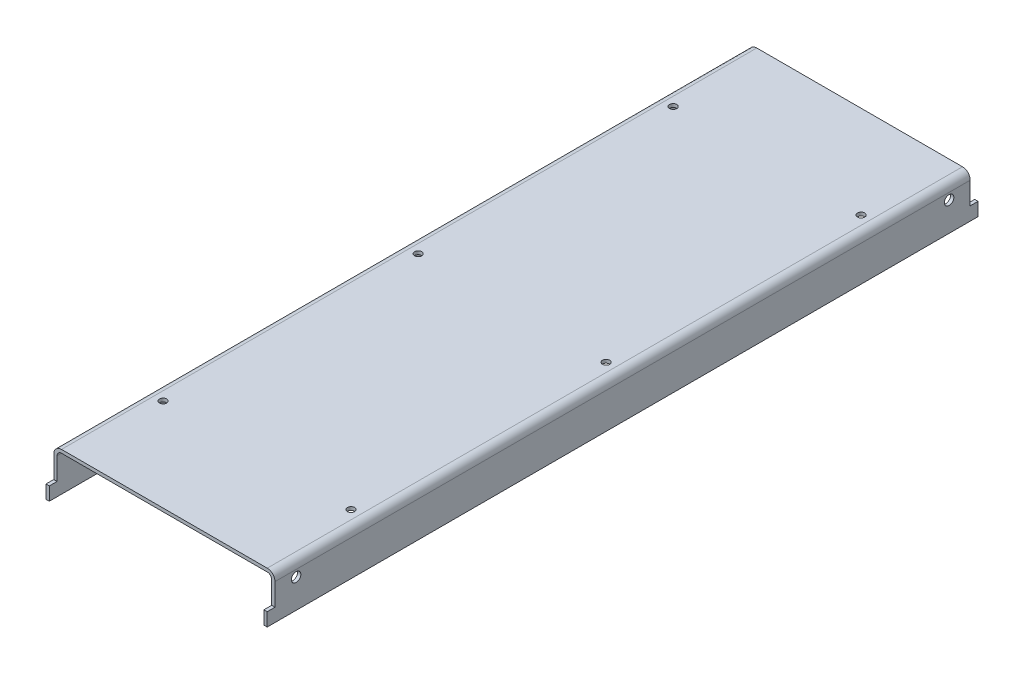
ISO-10303-21;
HEADER;
FILE_DESCRIPTION(('STEP AP214'),'2;1');
FILE_NAME('part.step','',(''),(''),'','','');
FILE_SCHEMA(('AUTOMOTIVE_DESIGN { 1 0 10303 214 1 1 1 1 }'));
ENDSEC;
DATA;
#1=APPLICATION_CONTEXT('core data for automotive mechanical design processes');
#2=APPLICATION_PROTOCOL_DEFINITION('international standard','automotive_design',2000,#1);
#3=PRODUCT_CONTEXT('',#1,'mechanical');
#4=PRODUCT('Part','Part','',(#3));
#5=PRODUCT_RELATED_PRODUCT_CATEGORY('part','',(#4));
#6=PRODUCT_DEFINITION_FORMATION('','',#4);
#7=PRODUCT_DEFINITION_CONTEXT('part definition',#1,'design');
#8=PRODUCT_DEFINITION('design','',#6,#7);
#9=PRODUCT_DEFINITION_SHAPE('','',#8);
#10=(LENGTH_UNIT() NAMED_UNIT(*) SI_UNIT(.MILLI.,.METRE.));
#11=(NAMED_UNIT(*) PLANE_ANGLE_UNIT() SI_UNIT($,.RADIAN.));
#12=(NAMED_UNIT(*) SI_UNIT($,.STERADIAN.) SOLID_ANGLE_UNIT());
#13=UNCERTAINTY_MEASURE_WITH_UNIT(LENGTH_MEASURE(1.E-05),#10,'distance_accuracy_value','');
#14=(GEOMETRIC_REPRESENTATION_CONTEXT(3) GLOBAL_UNCERTAINTY_ASSIGNED_CONTEXT((#13)) GLOBAL_UNIT_ASSIGNED_CONTEXT((#10,
#11,#12)) REPRESENTATION_CONTEXT('',''));
#15=CARTESIAN_POINT('',(0.,0.,0.));
#16=DIRECTION('',(0.,0.,1.));
#17=DIRECTION('',(1.,0.,0.));
#18=AXIS2_PLACEMENT_3D('',#15,#16,#17);
#19=CARTESIAN_POINT('',(0.,12.4919236737995,320.5));
#20=DIRECTION('',(0.,0.,1.));
#21=DIRECTION('',(1.,0.,0.));
#22=AXIS2_PLACEMENT_3D('',#19,#20,#21);
#23=PLANE('',#22);
#24=DIRECTION('',(1.,0.,0.));
#25=VECTOR('',#24,1.);
#26=CARTESIAN_POINT('',(99.753,-19.5,320.5));
#27=LINE('',#26,#25);
#28=CARTESIAN_POINT('',(99.753,-19.5,320.5));
#29=VERTEX_POINT('',#28);
#30=CARTESIAN_POINT('',(96.753,-19.5,320.5));
#31=VERTEX_POINT('',#30);
#32=EDGE_CURVE('E154',#29,#31,#27,.F.);
#33=ORIENTED_EDGE('',*,*,#32,.F.);
#34=DIRECTION('',(0.,1.,0.));
#35=VECTOR('',#34,1.);
#36=CARTESIAN_POINT('',(99.753,19.5,320.5));
#37=LINE('',#36,#35);
#38=CARTESIAN_POINT('',(99.753,-7.5,320.5));
#39=VERTEX_POINT('',#38);
#40=EDGE_CURVE('E337',#39,#29,#37,.F.);
#41=ORIENTED_EDGE('',*,*,#40,.F.);
#42=DIRECTION('',(1.,0.,0.));
#43=VECTOR('',#42,1.);
#44=CARTESIAN_POINT('',(99.753,-7.5,320.5));
#45=LINE('',#44,#43);
#46=CARTESIAN_POINT('',(96.753,-7.5,320.5));
#47=VERTEX_POINT('',#46);
#48=EDGE_CURVE('E169',#39,#47,#45,.F.);
#49=ORIENTED_EDGE('',*,*,#48,.T.);
#50=DIRECTION('',(0.,1.,0.));
#51=VECTOR('',#50,1.);
#52=CARTESIAN_POINT('',(96.753,-19.5,320.5));
#53=LINE('',#52,#51);
#54=EDGE_CURVE('E168',#31,#47,#53,.T.);
#55=ORIENTED_EDGE('',*,*,#54,.F.);
#56=EDGE_LOOP('',(#33,#41,#49,#55));
#57=FACE_BOUND('',#56,.T.);
#58=ADVANCED_FACE('F17',(#57),#23,.T.);
#59=CARTESIAN_POINT('',(99.753,-19.5,-320.5));
#60=DIRECTION('',(0.,-1.,0.));
#61=DIRECTION('',(0.,0.,-1.));
#62=AXIS2_PLACEMENT_3D('',#59,#60,#61);
#63=PLANE('',#62);
#64=DIRECTION('',(1.,0.,0.));
#65=VECTOR('',#64,1.);
#66=CARTESIAN_POINT('',(0.,-19.5,-320.5));
#67=LINE('',#66,#65);
#68=CARTESIAN_POINT('',(96.753,-19.5,-320.5));
#69=VERTEX_POINT('',#68);
#70=CARTESIAN_POINT('',(99.753,-19.5,-320.5));
#71=VERTEX_POINT('',#70);
#72=EDGE_CURVE('E165',#69,#71,#67,.T.);
#73=ORIENTED_EDGE('',*,*,#72,.T.);
#74=DIRECTION('',(0.,0.,-1.));
#75=VECTOR('',#74,1.);
#76=CARTESIAN_POINT('',(99.753,-19.5,-320.5));
#77=LINE('',#76,#75);
#78=EDGE_CURVE('E161',#29,#71,#77,.T.);
#79=ORIENTED_EDGE('',*,*,#78,.F.);
#80=ORIENTED_EDGE('',*,*,#32,.T.);
#81=DIRECTION('',(0.,0.,1.));
#82=VECTOR('',#81,1.);
#83=CARTESIAN_POINT('',(96.753,-19.5,-320.5));
#84=LINE('',#83,#82);
#85=EDGE_CURVE('E158',#69,#31,#84,.T.);
#86=ORIENTED_EDGE('',*,*,#85,.F.);
#87=EDGE_LOOP('',(#73,#79,#80,#86));
#88=FACE_BOUND('',#87,.T.);
#89=ADVANCED_FACE('F156',(#88),#63,.T.);
#90=CARTESIAN_POINT('',(0.,12.4919236737995,-320.5));
#91=DIRECTION('',(0.,0.,1.));
#92=DIRECTION('',(1.,0.,0.));
#93=AXIS2_PLACEMENT_3D('',#90,#91,#92);
#94=PLANE('',#93);
#95=DIRECTION('',(0.,1.,0.));
#96=VECTOR('',#95,1.);
#97=CARTESIAN_POINT('',(99.753,19.5,-320.5));
#98=LINE('',#97,#96);
#99=CARTESIAN_POINT('',(99.753,-7.5,-320.5));
#100=VERTEX_POINT('',#99);
#101=EDGE_CURVE('E373',#71,#100,#98,.T.);
#102=ORIENTED_EDGE('',*,*,#101,.F.);
#103=ORIENTED_EDGE('',*,*,#72,.F.);
#104=DIRECTION('',(0.,1.,0.));
#105=VECTOR('',#104,1.);
#106=CARTESIAN_POINT('',(96.753,-19.5,-320.5));
#107=LINE('',#106,#105);
#108=CARTESIAN_POINT('',(96.753,-7.5,-320.5));
#109=VERTEX_POINT('',#108);
#110=EDGE_CURVE('E175',#109,#69,#107,.F.);
#111=ORIENTED_EDGE('',*,*,#110,.F.);
#112=DIRECTION('',(1.,0.,0.));
#113=VECTOR('',#112,1.);
#114=CARTESIAN_POINT('',(99.753,-7.5,-320.5));
#115=LINE('',#114,#113);
#116=EDGE_CURVE('E281',#109,#100,#115,.T.);
#117=ORIENTED_EDGE('',*,*,#116,.T.);
#118=EDGE_LOOP('',(#102,#103,#111,#117));
#119=FACE_BOUND('',#118,.T.);
#120=ADVANCED_FACE('F577',(#119),#94,.F.);
#121=CARTESIAN_POINT('',(99.7530000000001,6.5,-294.45));
#122=DIRECTION('',(-1.,0.,0.));
#123=DIRECTION('',(0.,0.,1.));
#124=AXIS2_PLACEMENT_3D('',#121,#122,#123);
#125=CYLINDRICAL_SURFACE('',#124,4.24999999999998);
#126=CARTESIAN_POINT('',(96.753,6.5,-294.45));
#127=DIRECTION('',(-1.,0.,0.));
#128=DIRECTION('',(0.,0.,1.));
#129=AXIS2_PLACEMENT_3D('',#126,#127,#128);
#130=CIRCLE('',#129,4.24999999999998);
#131=CARTESIAN_POINT('',(96.753,6.5,-290.2));
#132=VERTEX_POINT('',#131);
#133=EDGE_CURVE('E282',#132,#132,#130,.F.);
#134=ORIENTED_EDGE('',*,*,#133,.F.);
#135=EDGE_LOOP('',(#134));
#136=FACE_BOUND('',#135,.T.);
#137=CARTESIAN_POINT('',(99.753,6.5,-294.45));
#138=DIRECTION('',(-1.,0.,0.));
#139=DIRECTION('',(0.,0.,1.));
#140=AXIS2_PLACEMENT_3D('',#137,#138,#139);
#141=CIRCLE('',#140,4.24999999999998);
#142=CARTESIAN_POINT('',(99.753,6.5,-290.2));
#143=VERTEX_POINT('',#142);
#144=EDGE_CURVE('E274',#143,#143,#141,.T.);
#145=ORIENTED_EDGE('',*,*,#144,.F.);
#146=EDGE_LOOP('',(#145));
#147=FACE_BOUND('',#146,.T.);
#148=ADVANCED_FACE('F580',(#136,#147),#125,.F.);
#149=CARTESIAN_POINT('',(99.7530000000001,6.5,294.45));
#150=DIRECTION('',(-1.,0.,0.));
#151=DIRECTION('',(0.,0.,1.));
#152=AXIS2_PLACEMENT_3D('',#149,#150,#151);
#153=CYLINDRICAL_SURFACE('',#152,4.25000000000003);
#154=CARTESIAN_POINT('',(96.753,6.5,294.45));
#155=DIRECTION('',(-1.,0.,0.));
#156=DIRECTION('',(0.,0.,1.));
#157=AXIS2_PLACEMENT_3D('',#154,#155,#156);
#158=CIRCLE('',#157,4.25000000000003);
#159=CARTESIAN_POINT('',(96.753,6.5,298.7));
#160=VERTEX_POINT('',#159);
#161=EDGE_CURVE('E278',#160,#160,#158,.F.);
#162=ORIENTED_EDGE('',*,*,#161,.F.);
#163=EDGE_LOOP('',(#162));
#164=FACE_BOUND('',#163,.T.);
#165=CARTESIAN_POINT('',(99.753,6.5,294.45));
#166=DIRECTION('',(-1.,0.,0.));
#167=DIRECTION('',(0.,0.,1.));
#168=AXIS2_PLACEMENT_3D('',#165,#166,#167);
#169=CIRCLE('',#168,4.25000000000003);
#170=CARTESIAN_POINT('',(99.753,6.5,298.7));
#171=VERTEX_POINT('',#170);
#172=EDGE_CURVE('E270',#171,#171,#169,.T.);
#173=ORIENTED_EDGE('',*,*,#172,.F.);
#174=EDGE_LOOP('',(#173));
#175=FACE_BOUND('',#174,.T.);
#176=ADVANCED_FACE('F576',(#164,#175),#153,.F.);
#177=CARTESIAN_POINT('',(0.,12.4919236737995,-320.5));
#178=DIRECTION('',(0.,0.,1.));
#179=DIRECTION('',(1.,0.,0.));
#180=AXIS2_PLACEMENT_3D('',#177,#178,#179);
#181=PLANE('',#180);
#182=DIRECTION('',(0.,1.,0.));
#183=VECTOR('',#182,1.);
#184=CARTESIAN_POINT('',(-96.753,16.5,-320.5));
#185=LINE('',#184,#183);
#186=CARTESIAN_POINT('',(-96.753,-19.5,-320.5));
#187=VERTEX_POINT('',#186);
#188=CARTESIAN_POINT('',(-96.753,-7.5,-320.5));
#189=VERTEX_POINT('',#188);
#190=EDGE_CURVE('E183',#187,#189,#185,.T.);
#191=ORIENTED_EDGE('',*,*,#190,.F.);
#192=DIRECTION('',(1.,0.,0.));
#193=VECTOR('',#192,1.);
#194=CARTESIAN_POINT('',(-96.753,-19.5,-320.5));
#195=LINE('',#194,#193);
#196=CARTESIAN_POINT('',(-99.753,-19.5,-320.5));
#197=VERTEX_POINT('',#196);
#198=EDGE_CURVE('E352',#197,#187,#195,.T.);
#199=ORIENTED_EDGE('',*,*,#198,.F.);
#200=DIRECTION('',(0.,1.,0.));
#201=VECTOR('',#200,1.);
#202=CARTESIAN_POINT('',(-99.753,-19.5,-320.5));
#203=LINE('',#202,#201);
#204=CARTESIAN_POINT('',(-99.753,-7.5,-320.5));
#205=VERTEX_POINT('',#204);
#206=EDGE_CURVE('E309',#205,#197,#203,.F.);
#207=ORIENTED_EDGE('',*,*,#206,.F.);
#208=DIRECTION('',(1.,0.,0.));
#209=VECTOR('',#208,1.);
#210=CARTESIAN_POINT('',(99.753,-7.5,-320.5));
#211=LINE('',#210,#209);
#212=EDGE_CURVE('E324',#205,#189,#211,.T.);
#213=ORIENTED_EDGE('',*,*,#212,.T.);
#214=EDGE_LOOP('',(#191,#199,#207,#213));
#215=FACE_BOUND('',#214,.T.);
#216=ADVANCED_FACE('F496',(#215),#181,.F.);
#217=CARTESIAN_POINT('',(-96.753,-19.5,-320.5));
#218=DIRECTION('',(0.,-1.,0.));
#219=DIRECTION('',(0.,0.,-1.));
#220=AXIS2_PLACEMENT_3D('',#217,#218,#219);
#221=PLANE('',#220);
#222=ORIENTED_EDGE('',*,*,#198,.T.);
#223=DIRECTION('',(0.,0.,-1.));
#224=VECTOR('',#223,1.);
#225=CARTESIAN_POINT('',(-96.753,-19.5,-320.5));
#226=LINE('',#225,#224);
#227=CARTESIAN_POINT('',(-96.753,-19.5,320.5));
#228=VERTEX_POINT('',#227);
#229=EDGE_CURVE('E187',#228,#187,#226,.T.);
#230=ORIENTED_EDGE('',*,*,#229,.F.);
#231=DIRECTION('',(1.,0.,0.));
#232=VECTOR('',#231,1.);
#233=CARTESIAN_POINT('',(0.,-19.5,320.5));
#234=LINE('',#233,#232);
#235=CARTESIAN_POINT('',(-99.753,-19.5,320.5));
#236=VERTEX_POINT('',#235);
#237=EDGE_CURVE('E350',#236,#228,#234,.T.);
#238=ORIENTED_EDGE('',*,*,#237,.F.);
#239=DIRECTION('',(0.,0.,1.));
#240=VECTOR('',#239,1.);
#241=CARTESIAN_POINT('',(-99.753,-19.5,-320.5));
#242=LINE('',#241,#240);
#243=EDGE_CURVE('E347',#197,#236,#242,.T.);
#244=ORIENTED_EDGE('',*,*,#243,.F.);
#245=EDGE_LOOP('',(#222,#230,#238,#244));
#246=FACE_BOUND('',#245,.T.);
#247=ADVANCED_FACE('F493',(#246),#221,.T.);
#248=CARTESIAN_POINT('',(0.,12.4919236737995,320.5));
#249=DIRECTION('',(0.,0.,1.));
#250=DIRECTION('',(1.,0.,0.));
#251=AXIS2_PLACEMENT_3D('',#248,#249,#250);
#252=PLANE('',#251);
#253=ORIENTED_EDGE('',*,*,#237,.T.);
#254=DIRECTION('',(0.,1.,0.));
#255=VECTOR('',#254,1.);
#256=CARTESIAN_POINT('',(-96.753,16.5,320.5));
#257=LINE('',#256,#255);
#258=CARTESIAN_POINT('',(-96.753,-7.5,320.5));
#259=VERTEX_POINT('',#258);
#260=EDGE_CURVE('E192',#259,#228,#257,.F.);
#261=ORIENTED_EDGE('',*,*,#260,.F.);
#262=DIRECTION('',(1.,0.,0.));
#263=VECTOR('',#262,1.);
#264=CARTESIAN_POINT('',(99.753,-7.5,320.5));
#265=LINE('',#264,#263);
#266=CARTESIAN_POINT('',(-99.753,-7.5,320.5));
#267=VERTEX_POINT('',#266);
#268=EDGE_CURVE('E341',#259,#267,#265,.F.);
#269=ORIENTED_EDGE('',*,*,#268,.T.);
#270=DIRECTION('',(0.,1.,0.));
#271=VECTOR('',#270,1.);
#272=CARTESIAN_POINT('',(-99.753,-19.5,320.5));
#273=LINE('',#272,#271);
#274=EDGE_CURVE('E314',#236,#267,#273,.T.);
#275=ORIENTED_EDGE('',*,*,#274,.F.);
#276=EDGE_LOOP('',(#253,#261,#269,#275));
#277=FACE_BOUND('',#276,.T.);
#278=ADVANCED_FACE('F488',(#277),#252,.T.);
#279=CARTESIAN_POINT('',(-96.753,6.5,-294.45));
#280=DIRECTION('',(-1.,0.,0.));
#281=DIRECTION('',(0.,0.,1.));
#282=AXIS2_PLACEMENT_3D('',#279,#280,#281);
#283=CYLINDRICAL_SURFACE('',#282,4.24999999999998);
#284=CARTESIAN_POINT('',(-99.753,6.5,-294.45));
#285=DIRECTION('',(-1.,0.,0.));
#286=DIRECTION('',(0.,0.,1.));
#287=AXIS2_PLACEMENT_3D('',#284,#285,#286);
#288=CIRCLE('',#287,4.24999999999998);
#289=CARTESIAN_POINT('',(-99.753,6.5,-290.2));
#290=VERTEX_POINT('',#289);
#291=EDGE_CURVE('E266',#290,#290,#288,.F.);
#292=ORIENTED_EDGE('',*,*,#291,.F.);
#293=EDGE_LOOP('',(#292));
#294=FACE_BOUND('',#293,.T.);
#295=CARTESIAN_POINT('',(-96.753,6.5,-294.45));
#296=DIRECTION('',(-1.,0.,0.));
#297=DIRECTION('',(0.,0.,1.));
#298=AXIS2_PLACEMENT_3D('',#295,#296,#297);
#299=CIRCLE('',#298,4.24999999999998);
#300=CARTESIAN_POINT('',(-96.753,6.5,-290.2));
#301=VERTEX_POINT('',#300);
#302=EDGE_CURVE('E21',#301,#301,#299,.T.);
#303=ORIENTED_EDGE('',*,*,#302,.F.);
#304=EDGE_LOOP('',(#303));
#305=FACE_BOUND('',#304,.T.);
#306=ADVANCED_FACE('F571',(#294,#305),#283,.F.);
#307=CARTESIAN_POINT('',(-96.753,6.5,294.45));
#308=DIRECTION('',(-1.,0.,0.));
#309=DIRECTION('',(0.,0.,1.));
#310=AXIS2_PLACEMENT_3D('',#307,#308,#309);
#311=CYLINDRICAL_SURFACE('',#310,4.25000000000003);
#312=CARTESIAN_POINT('',(-99.753,6.5,294.45));
#313=DIRECTION('',(-1.,0.,0.));
#314=DIRECTION('',(0.,0.,1.));
#315=AXIS2_PLACEMENT_3D('',#312,#313,#314);
#316=CIRCLE('',#315,4.25000000000003);
#317=CARTESIAN_POINT('',(-99.753,6.5,298.7));
#318=VERTEX_POINT('',#317);
#319=EDGE_CURVE('E262',#318,#318,#316,.F.);
#320=ORIENTED_EDGE('',*,*,#319,.F.);
#321=EDGE_LOOP('',(#320));
#322=FACE_BOUND('',#321,.T.);
#323=CARTESIAN_POINT('',(-96.753,6.5,294.45));
#324=DIRECTION('',(-1.,0.,0.));
#325=DIRECTION('',(0.,0.,1.));
#326=AXIS2_PLACEMENT_3D('',#323,#324,#325);
#327=CIRCLE('',#326,4.25000000000003);
#328=CARTESIAN_POINT('',(-96.753,6.5,298.7));
#329=VERTEX_POINT('',#328);
#330=EDGE_CURVE('E284',#329,#329,#327,.T.);
#331=ORIENTED_EDGE('',*,*,#330,.F.);
#332=EDGE_LOOP('',(#331));
#333=FACE_BOUND('',#332,.T.);
#334=ADVANCED_FACE('F568',(#322,#333),#311,.F.);
#335=CARTESIAN_POINT('',(99.753,-7.5,320.5));
#336=DIRECTION('',(0.,-1.,0.));
#337=DIRECTION('',(0.,0.,-1.));
#338=AXIS2_PLACEMENT_3D('',#335,#336,#337);
#339=PLANE('',#338);
#340=ORIENTED_EDGE('',*,*,#48,.F.);
#341=DIRECTION('',(0.,0.,-1.));
#342=VECTOR('',#341,1.);
#343=CARTESIAN_POINT('',(99.753,-7.5,-320.5));
#344=LINE('',#343,#342);
#345=CARTESIAN_POINT('',(99.753,-7.5,313.5));
#346=VERTEX_POINT('',#345);
#347=EDGE_CURVE('E334',#346,#39,#344,.F.);
#348=ORIENTED_EDGE('',*,*,#347,.F.);
#349=DIRECTION('',(-1.,0.,0.));
#350=VECTOR('',#349,1.);
#351=CARTESIAN_POINT('',(99.753,-7.5,313.5));
#352=LINE('',#351,#350);
#353=CARTESIAN_POINT('',(96.753,-7.5,313.5));
#354=VERTEX_POINT('',#353);
#355=EDGE_CURVE('E99',#346,#354,#352,.T.);
#356=ORIENTED_EDGE('',*,*,#355,.T.);
#357=DIRECTION('',(0.,0.,1.));
#358=VECTOR('',#357,1.);
#359=CARTESIAN_POINT('',(96.753,-7.5,-320.5));
#360=LINE('',#359,#358);
#361=EDGE_CURVE('E171',#47,#354,#360,.F.);
#362=ORIENTED_EDGE('',*,*,#361,.F.);
#363=EDGE_LOOP('',(#340,#348,#356,#362));
#364=FACE_BOUND('',#363,.T.);
#365=ADVANCED_FACE('F397',(#364),#339,.F.);
#366=CARTESIAN_POINT('',(99.753,-7.5,320.5));
#367=DIRECTION('',(0.,-1.,0.));
#368=DIRECTION('',(0.,0.,-1.));
#369=AXIS2_PLACEMENT_3D('',#366,#367,#368);
#370=PLANE('',#369);
#371=ORIENTED_EDGE('',*,*,#268,.F.);
#372=DIRECTION('',(0.,0.,-1.));
#373=VECTOR('',#372,1.);
#374=CARTESIAN_POINT('',(-96.753,-7.5,-320.5));
#375=LINE('',#374,#373);
#376=CARTESIAN_POINT('',(-96.753,-7.5,313.5));
#377=VERTEX_POINT('',#376);
#378=EDGE_CURVE('E197',#377,#259,#375,.F.);
#379=ORIENTED_EDGE('',*,*,#378,.F.);
#380=DIRECTION('',(-1.,0.,0.));
#381=VECTOR('',#380,1.);
#382=CARTESIAN_POINT('',(99.753,-7.5,313.5));
#383=LINE('',#382,#381);
#384=CARTESIAN_POINT('',(-99.753,-7.5,313.5));
#385=VERTEX_POINT('',#384);
#386=EDGE_CURVE('E317',#377,#385,#383,.T.);
#387=ORIENTED_EDGE('',*,*,#386,.T.);
#388=DIRECTION('',(0.,0.,1.));
#389=VECTOR('',#388,1.);
#390=CARTESIAN_POINT('',(-99.753,-7.5,-320.5));
#391=LINE('',#390,#389);
#392=EDGE_CURVE('E269',#267,#385,#391,.F.);
#393=ORIENTED_EDGE('',*,*,#392,.F.);
#394=EDGE_LOOP('',(#371,#379,#387,#393));
#395=FACE_BOUND('',#394,.T.);
#396=ADVANCED_FACE('F480',(#395),#370,.F.);
#397=CARTESIAN_POINT('',(99.753,-7.5,-313.5));
#398=DIRECTION('',(0.,-1.,0.));
#399=DIRECTION('',(0.,0.,-1.));
#400=AXIS2_PLACEMENT_3D('',#397,#398,#399);
#401=PLANE('',#400);
#402=DIRECTION('',(1.,0.,0.));
#403=VECTOR('',#402,1.);
#404=CARTESIAN_POINT('',(99.753,-7.5,-313.5));
#405=LINE('',#404,#403);
#406=CARTESIAN_POINT('',(-99.753,-7.5,-313.5));
#407=VERTEX_POINT('',#406);
#408=CARTESIAN_POINT('',(-96.753,-7.5,-313.5));
#409=VERTEX_POINT('',#408);
#410=EDGE_CURVE('E302',#407,#409,#405,.T.);
#411=ORIENTED_EDGE('',*,*,#410,.T.);
#412=DIRECTION('',(0.,0.,-1.));
#413=VECTOR('',#412,1.);
#414=CARTESIAN_POINT('',(-96.753,-7.5,-320.5));
#415=LINE('',#414,#413);
#416=EDGE_CURVE('E186',#189,#409,#415,.F.);
#417=ORIENTED_EDGE('',*,*,#416,.F.);
#418=ORIENTED_EDGE('',*,*,#212,.F.);
#419=DIRECTION('',(0.,0.,1.));
#420=VECTOR('',#419,1.);
#421=CARTESIAN_POINT('',(-99.753,-7.5,-320.5));
#422=LINE('',#421,#420);
#423=EDGE_CURVE('E273',#407,#205,#422,.F.);
#424=ORIENTED_EDGE('',*,*,#423,.F.);
#425=EDGE_LOOP('',(#411,#417,#418,#424));
#426=FACE_BOUND('',#425,.T.);
#427=ADVANCED_FACE('F499',(#426),#401,.F.);
#428=CARTESIAN_POINT('',(-96.753,16.5,-320.5));
#429=DIRECTION('',(1.,0.,0.));
#430=DIRECTION('',(0.,0.,-1.));
#431=AXIS2_PLACEMENT_3D('',#428,#429,#430);
#432=PLANE('',#431);
#433=ORIENTED_EDGE('',*,*,#330,.T.);
#434=EDGE_LOOP('',(#433));
#435=FACE_BOUND('',#434,.T.);
#436=ORIENTED_EDGE('',*,*,#302,.T.);
#437=EDGE_LOOP('',(#436));
#438=FACE_BOUND('',#437,.T.);
#439=DIRECTION('',(0.,1.,0.));
#440=VECTOR('',#439,1.);
#441=CARTESIAN_POINT('',(-96.753,19.5,-313.5));
#442=LINE('',#441,#440);
#443=CARTESIAN_POINT('',(-96.753,12.5,-313.5));
#444=VERTEX_POINT('',#443);
#445=EDGE_CURVE('E248',#409,#444,#442,.T.);
#446=ORIENTED_EDGE('',*,*,#445,.T.);
#447=DIRECTION('',(0.,0.,1.));
#448=VECTOR('',#447,1.);
#449=CARTESIAN_POINT('',(-96.753,12.5,0.));
#450=LINE('',#449,#448);
#451=CARTESIAN_POINT('',(-96.753,12.5,313.5));
#452=VERTEX_POINT('',#451);
#453=EDGE_CURVE('E286',#444,#452,#450,.T.);
#454=ORIENTED_EDGE('',*,*,#453,.T.);
#455=DIRECTION('',(0.,1.,0.));
#456=VECTOR('',#455,1.);
#457=CARTESIAN_POINT('',(-96.753,-7.5,313.5));
#458=LINE('',#457,#456);
#459=EDGE_CURVE('E257',#452,#377,#458,.F.);
#460=ORIENTED_EDGE('',*,*,#459,.T.);
#461=ORIENTED_EDGE('',*,*,#378,.T.);
#462=ORIENTED_EDGE('',*,*,#260,.T.);
#463=ORIENTED_EDGE('',*,*,#229,.T.);
#464=ORIENTED_EDGE('',*,*,#190,.T.);
#465=ORIENTED_EDGE('',*,*,#416,.T.);
#466=EDGE_LOOP('',(#446,#454,#460,#461,#462,#463,#464,#465));
#467=FACE_BOUND('',#466,.T.);
#468=ADVANCED_FACE('F475',(#435,#438,#467),#432,.T.);
#469=CARTESIAN_POINT('',(-92.753,12.5,0.));
#470=DIRECTION('',(0.,0.,1.));
#471=DIRECTION('',(1.,0.,0.));
#472=AXIS2_PLACEMENT_3D('',#469,#470,#471);
#473=CYLINDRICAL_SURFACE('',#472,4.);
#474=ORIENTED_EDGE('',*,*,#453,.F.);
#475=CARTESIAN_POINT('',(-92.753,12.5,-313.5));
#476=DIRECTION('',(0.,0.,1.));
#477=DIRECTION('',(1.,0.,0.));
#478=AXIS2_PLACEMENT_3D('',#475,#476,#477);
#479=CIRCLE('',#478,4.);
#480=CARTESIAN_POINT('',(-92.753,16.5,-313.5));
#481=VERTEX_POINT('',#480);
#482=EDGE_CURVE('E246',#444,#481,#479,.F.);
#483=ORIENTED_EDGE('',*,*,#482,.T.);
#484=DIRECTION('',(0.,0.,-1.));
#485=VECTOR('',#484,1.);
#486=CARTESIAN_POINT('',(-92.753,16.5,-320.5));
#487=LINE('',#486,#485);
#488=CARTESIAN_POINT('',(-92.753,16.5,313.5));
#489=VERTEX_POINT('',#488);
#490=EDGE_CURVE('E265',#489,#481,#487,.T.);
#491=ORIENTED_EDGE('',*,*,#490,.F.);
#492=CARTESIAN_POINT('',(-92.753,12.5,313.5));
#493=DIRECTION('',(0.,0.,1.));
#494=DIRECTION('',(1.,0.,0.));
#495=AXIS2_PLACEMENT_3D('',#492,#493,#494);
#496=CIRCLE('',#495,4.);
#497=EDGE_CURVE('E254',#489,#452,#496,.T.);
#498=ORIENTED_EDGE('',*,*,#497,.T.);
#499=EDGE_LOOP('',(#474,#483,#491,#498));
#500=FACE_BOUND('',#499,.T.);
#501=ADVANCED_FACE('F444',(#500),#473,.F.);
#502=CARTESIAN_POINT('',(92.753,12.5,0.));
#503=DIRECTION('',(0.,0.,1.));
#504=DIRECTION('',(1.,0.,0.));
#505=AXIS2_PLACEMENT_3D('',#502,#503,#504);
#506=CYLINDRICAL_SURFACE('',#505,4.);
#507=DIRECTION('',(0.,0.,-1.));
#508=VECTOR('',#507,1.);
#509=CARTESIAN_POINT('',(92.753,16.5,-320.5));
#510=LINE('',#509,#508);
#511=CARTESIAN_POINT('',(92.753,16.5,-313.5));
#512=VERTEX_POINT('',#511);
#513=CARTESIAN_POINT('',(92.753,16.5,313.5));
#514=VERTEX_POINT('',#513);
#515=EDGE_CURVE('E410',#512,#514,#510,.F.);
#516=ORIENTED_EDGE('',*,*,#515,.F.);
#517=CARTESIAN_POINT('',(92.753,12.5,-313.5));
#518=DIRECTION('',(0.,0.,1.));
#519=DIRECTION('',(1.,0.,0.));
#520=AXIS2_PLACEMENT_3D('',#517,#518,#519);
#521=CIRCLE('',#520,4.);
#522=CARTESIAN_POINT('',(96.753,12.5,-313.5));
#523=VERTEX_POINT('',#522);
#524=EDGE_CURVE('E242',#512,#523,#521,.F.);
#525=ORIENTED_EDGE('',*,*,#524,.T.);
#526=DIRECTION('',(0.,0.,1.));
#527=VECTOR('',#526,1.);
#528=CARTESIAN_POINT('',(96.753,12.5,-320.5));
#529=LINE('',#528,#527);
#530=CARTESIAN_POINT('',(96.753,12.5,313.5));
#531=VERTEX_POINT('',#530);
#532=EDGE_CURVE('E90',#531,#523,#529,.F.);
#533=ORIENTED_EDGE('',*,*,#532,.F.);
#534=CARTESIAN_POINT('',(92.753,12.5,313.5));
#535=DIRECTION('',(0.,0.,1.));
#536=DIRECTION('',(1.,0.,0.));
#537=AXIS2_PLACEMENT_3D('',#534,#535,#536);
#538=CIRCLE('',#537,4.);
#539=EDGE_CURVE('E259',#531,#514,#538,.T.);
#540=ORIENTED_EDGE('',*,*,#539,.T.);
#541=EDGE_LOOP('',(#516,#525,#533,#540));
#542=FACE_BOUND('',#541,.T.);
#543=ADVANCED_FACE('F554',(#542),#506,.F.);
#544=CARTESIAN_POINT('',(96.753,-19.5,-320.5));
#545=DIRECTION('',(-1.,0.,0.));
#546=DIRECTION('',(0.,0.,1.));
#547=AXIS2_PLACEMENT_3D('',#544,#545,#546);
#548=PLANE('',#547);
#549=ORIENTED_EDGE('',*,*,#161,.T.);
#550=EDGE_LOOP('',(#549));
#551=FACE_BOUND('',#550,.T.);
#552=ORIENTED_EDGE('',*,*,#133,.T.);
#553=EDGE_LOOP('',(#552));
#554=FACE_BOUND('',#553,.T.);
#555=ORIENTED_EDGE('',*,*,#54,.T.);
#556=ORIENTED_EDGE('',*,*,#361,.T.);
#557=DIRECTION('',(0.,1.,0.));
#558=VECTOR('',#557,1.);
#559=CARTESIAN_POINT('',(96.753,-7.5,313.5));
#560=LINE('',#559,#558);
#561=EDGE_CURVE('E261',#354,#531,#560,.T.);
#562=ORIENTED_EDGE('',*,*,#561,.T.);
#563=ORIENTED_EDGE('',*,*,#532,.T.);
#564=DIRECTION('',(0.,1.,0.));
#565=VECTOR('',#564,1.);
#566=CARTESIAN_POINT('',(96.753,19.5,-313.5));
#567=LINE('',#566,#565);
#568=CARTESIAN_POINT('',(96.753,-7.5,-313.5));
#569=VERTEX_POINT('',#568);
#570=EDGE_CURVE('E244',#523,#569,#567,.F.);
#571=ORIENTED_EDGE('',*,*,#570,.T.);
#572=DIRECTION('',(0.,0.,-1.));
#573=VECTOR('',#572,1.);
#574=CARTESIAN_POINT('',(96.753,-7.5,-313.5));
#575=LINE('',#574,#573);
#576=EDGE_CURVE('E338',#569,#109,#575,.T.);
#577=ORIENTED_EDGE('',*,*,#576,.T.);
#578=ORIENTED_EDGE('',*,*,#110,.T.);
#579=ORIENTED_EDGE('',*,*,#85,.T.);
#580=EDGE_LOOP('',(#555,#556,#562,#563,#571,#577,#578,#579));
#581=FACE_BOUND('',#580,.T.);
#582=ADVANCED_FACE('F173',(#551,#554,#581),#548,.T.);
#583=CARTESIAN_POINT('',(99.753,-7.5,-313.5));
#584=DIRECTION('',(0.,-1.,0.));
#585=DIRECTION('',(0.,0.,-1.));
#586=AXIS2_PLACEMENT_3D('',#583,#584,#585);
#587=PLANE('',#586);
#588=DIRECTION('',(1.,0.,0.));
#589=VECTOR('',#588,1.);
#590=CARTESIAN_POINT('',(99.753,-7.5,-313.5));
#591=LINE('',#590,#589);
#592=CARTESIAN_POINT('',(99.753,-7.5,-313.5));
#593=VERTEX_POINT('',#592);
#594=EDGE_CURVE('E421',#569,#593,#591,.T.);
#595=ORIENTED_EDGE('',*,*,#594,.T.);
#596=DIRECTION('',(0.,0.,-1.));
#597=VECTOR('',#596,1.);
#598=CARTESIAN_POINT('',(99.753,-7.5,-320.5));
#599=LINE('',#598,#597);
#600=EDGE_CURVE('E277',#100,#593,#599,.F.);
#601=ORIENTED_EDGE('',*,*,#600,.F.);
#602=ORIENTED_EDGE('',*,*,#116,.F.);
#603=ORIENTED_EDGE('',*,*,#576,.F.);
#604=EDGE_LOOP('',(#595,#601,#602,#603));
#605=FACE_BOUND('',#604,.T.);
#606=ADVANCED_FACE('F508',(#605),#587,.F.);
#607=CARTESIAN_POINT('',(99.753,19.5,-320.5));
#608=DIRECTION('',(1.,0.,0.));
#609=DIRECTION('',(0.,0.,-1.));
#610=AXIS2_PLACEMENT_3D('',#607,#608,#609);
#611=PLANE('',#610);
#612=ORIENTED_EDGE('',*,*,#172,.T.);
#613=EDGE_LOOP('',(#612));
#614=FACE_BOUND('',#613,.T.);
#615=ORIENTED_EDGE('',*,*,#144,.T.);
#616=EDGE_LOOP('',(#615));
#617=FACE_BOUND('',#616,.T.);
#618=DIRECTION('',(0.,1.,0.));
#619=VECTOR('',#618,1.);
#620=CARTESIAN_POINT('',(99.753,19.5,-313.5));
#621=LINE('',#620,#619);
#622=CARTESIAN_POINT('',(99.753,12.5,-313.5));
#623=VERTEX_POINT('',#622);
#624=EDGE_CURVE('E241',#593,#623,#621,.T.);
#625=ORIENTED_EDGE('',*,*,#624,.T.);
#626=DIRECTION('',(0.,0.,1.));
#627=VECTOR('',#626,1.);
#628=CARTESIAN_POINT('',(99.753,12.5,0.));
#629=LINE('',#628,#627);
#630=CARTESIAN_POINT('',(99.753,12.5,313.5));
#631=VERTEX_POINT('',#630);
#632=EDGE_CURVE('E252',#631,#623,#629,.F.);
#633=ORIENTED_EDGE('',*,*,#632,.F.);
#634=DIRECTION('',(0.,1.,0.));
#635=VECTOR('',#634,1.);
#636=CARTESIAN_POINT('',(99.753,-7.5,313.5));
#637=LINE('',#636,#635);
#638=EDGE_CURVE('E331',#631,#346,#637,.F.);
#639=ORIENTED_EDGE('',*,*,#638,.T.);
#640=ORIENTED_EDGE('',*,*,#347,.T.);
#641=ORIENTED_EDGE('',*,*,#40,.T.);
#642=ORIENTED_EDGE('',*,*,#78,.T.);
#643=ORIENTED_EDGE('',*,*,#101,.T.);
#644=ORIENTED_EDGE('',*,*,#600,.T.);
#645=EDGE_LOOP('',(#625,#633,#639,#640,#641,#642,#643,#644));
#646=FACE_BOUND('',#645,.T.);
#647=ADVANCED_FACE('F394',(#614,#617,#646),#611,.T.);
#648=CARTESIAN_POINT('',(-99.753,-19.5,-320.5));
#649=DIRECTION('',(-1.,0.,0.));
#650=DIRECTION('',(0.,0.,1.));
#651=AXIS2_PLACEMENT_3D('',#648,#649,#650);
#652=PLANE('',#651);
#653=ORIENTED_EDGE('',*,*,#319,.T.);
#654=EDGE_LOOP('',(#653));
#655=FACE_BOUND('',#654,.T.);
#656=ORIENTED_EDGE('',*,*,#291,.T.);
#657=EDGE_LOOP('',(#656));
#658=FACE_BOUND('',#657,.T.);
#659=ORIENTED_EDGE('',*,*,#274,.T.);
#660=ORIENTED_EDGE('',*,*,#392,.T.);
#661=DIRECTION('',(0.,1.,0.));
#662=VECTOR('',#661,1.);
#663=CARTESIAN_POINT('',(-99.753,-7.5,313.5));
#664=LINE('',#663,#662);
#665=CARTESIAN_POINT('',(-99.753,12.5,313.5));
#666=VERTEX_POINT('',#665);
#667=EDGE_CURVE('E253',#385,#666,#664,.T.);
#668=ORIENTED_EDGE('',*,*,#667,.T.);
#669=DIRECTION('',(0.,0.,1.));
#670=VECTOR('',#669,1.);
#671=CARTESIAN_POINT('',(-99.753,12.5,0.));
#672=LINE('',#671,#670);
#673=CARTESIAN_POINT('',(-99.753,12.5,-313.5));
#674=VERTEX_POINT('',#673);
#675=EDGE_CURVE('E234',#674,#666,#672,.T.);
#676=ORIENTED_EDGE('',*,*,#675,.F.);
#677=DIRECTION('',(0.,1.,0.));
#678=VECTOR('',#677,1.);
#679=CARTESIAN_POINT('',(-99.753,19.5,-313.5));
#680=LINE('',#679,#678);
#681=EDGE_CURVE('E304',#674,#407,#680,.F.);
#682=ORIENTED_EDGE('',*,*,#681,.T.);
#683=ORIENTED_EDGE('',*,*,#423,.T.);
#684=ORIENTED_EDGE('',*,*,#206,.T.);
#685=ORIENTED_EDGE('',*,*,#243,.T.);
#686=EDGE_LOOP('',(#659,#660,#668,#676,#682,#683,#684,#685));
#687=FACE_BOUND('',#686,.T.);
#688=ADVANCED_FACE('F483',(#655,#658,#687),#652,.T.);
#689=CARTESIAN_POINT('',(96.753,16.5,-320.5));
#690=DIRECTION('',(0.,-1.,0.));
#691=DIRECTION('',(0.,0.,-1.));
#692=AXIS2_PLACEMENT_3D('',#689,#690,#691);
#693=PLANE('',#692);
#694=CARTESIAN_POINT('',(84.7530000000001,16.5,229.899813400525));
#695=DIRECTION('',(0.,-1.,0.));
#696=DIRECTION('',(0.,0.,-1.));
#697=AXIS2_PLACEMENT_3D('',#694,#695,#696);
#698=CIRCLE('',#697,3.25000000000004);
#699=CARTESIAN_POINT('',(84.7530000000001,16.5,226.649813400525));
#700=VERTEX_POINT('',#699);
#701=EDGE_CURVE('E215',#700,#700,#698,.F.);
#702=ORIENTED_EDGE('',*,*,#701,.T.);
#703=EDGE_LOOP('',(#702));
#704=FACE_BOUND('',#703,.T.);
#705=CARTESIAN_POINT('',(84.753,16.5,-0.100186599474732));
#706=DIRECTION('',(0.,-1.,0.));
#707=DIRECTION('',(0.,0.,-1.));
#708=AXIS2_PLACEMENT_3D('',#705,#706,#707);
#709=CIRCLE('',#708,3.25);
#710=CARTESIAN_POINT('',(84.753,16.5,-3.35018659947473));
#711=VERTEX_POINT('',#710);
#712=EDGE_CURVE('E219',#711,#711,#709,.F.);
#713=ORIENTED_EDGE('',*,*,#712,.T.);
#714=EDGE_LOOP('',(#713));
#715=FACE_BOUND('',#714,.T.);
#716=CARTESIAN_POINT('',(84.753,16.5,-230.100186599475));
#717=DIRECTION('',(0.,-1.,0.));
#718=DIRECTION('',(0.,0.,-1.));
#719=AXIS2_PLACEMENT_3D('',#716,#717,#718);
#720=CIRCLE('',#719,3.24999999999995);
#721=CARTESIAN_POINT('',(84.753,16.5,-233.350186599475));
#722=VERTEX_POINT('',#721);
#723=EDGE_CURVE('E222',#722,#722,#720,.F.);
#724=ORIENTED_EDGE('',*,*,#723,.T.);
#725=EDGE_LOOP('',(#724));
#726=FACE_BOUND('',#725,.T.);
#727=CARTESIAN_POINT('',(-84.753,16.5,-230.100186599475));
#728=DIRECTION('',(0.,-1.,0.));
#729=DIRECTION('',(0.,0.,-1.));
#730=AXIS2_PLACEMENT_3D('',#727,#728,#729);
#731=CIRCLE('',#730,3.24999999999996);
#732=CARTESIAN_POINT('',(-84.753,16.5,-233.350186599475));
#733=VERTEX_POINT('',#732);
#734=EDGE_CURVE('E225',#733,#733,#731,.F.);
#735=ORIENTED_EDGE('',*,*,#734,.T.);
#736=EDGE_LOOP('',(#735));
#737=FACE_BOUND('',#736,.T.);
#738=CARTESIAN_POINT('',(-84.753,16.5,-0.100186599474732));
#739=DIRECTION('',(0.,-1.,0.));
#740=DIRECTION('',(0.,0.,-1.));
#741=AXIS2_PLACEMENT_3D('',#738,#739,#740);
#742=CIRCLE('',#741,3.25);
#743=CARTESIAN_POINT('',(-84.753,16.5,-3.35018659947473));
#744=VERTEX_POINT('',#743);
#745=EDGE_CURVE('E228',#744,#744,#742,.F.);
#746=ORIENTED_EDGE('',*,*,#745,.T.);
#747=EDGE_LOOP('',(#746));
#748=FACE_BOUND('',#747,.T.);
#749=CARTESIAN_POINT('',(-84.753,16.5,229.899813400525));
#750=DIRECTION('',(0.,-1.,0.));
#751=DIRECTION('',(0.,0.,-1.));
#752=AXIS2_PLACEMENT_3D('',#749,#750,#751);
#753=CIRCLE('',#752,3.25000000000002);
#754=CARTESIAN_POINT('',(-84.753,16.5,226.649813400525));
#755=VERTEX_POINT('',#754);
#756=EDGE_CURVE('E231',#755,#755,#753,.F.);
#757=ORIENTED_EDGE('',*,*,#756,.T.);
#758=EDGE_LOOP('',(#757));
#759=FACE_BOUND('',#758,.T.);
#760=DIRECTION('',(1.,0.,0.));
#761=VECTOR('',#760,1.);
#762=CARTESIAN_POINT('',(99.753,16.5,-313.5));
#763=LINE('',#762,#761);
#764=EDGE_CURVE('E245',#481,#512,#763,.T.);
#765=ORIENTED_EDGE('',*,*,#764,.T.);
#766=ORIENTED_EDGE('',*,*,#515,.T.);
#767=DIRECTION('',(-1.,0.,0.));
#768=VECTOR('',#767,1.);
#769=CARTESIAN_POINT('',(99.753,16.5,313.5));
#770=LINE('',#769,#768);
#771=EDGE_CURVE('E258',#514,#489,#770,.T.);
#772=ORIENTED_EDGE('',*,*,#771,.T.);
#773=ORIENTED_EDGE('',*,*,#490,.T.);
#774=EDGE_LOOP('',(#765,#766,#772,#773));
#775=FACE_BOUND('',#774,.T.);
#776=ADVANCED_FACE('F435',(#704,#715,#726,#737,#748,#759,#775),#693,.T.);
#777=CARTESIAN_POINT('',(99.753,-7.5,313.5));
#778=DIRECTION('',(0.,0.,-1.));
#779=DIRECTION('',(-1.,0.,0.));
#780=AXIS2_PLACEMENT_3D('',#777,#778,#779);
#781=PLANE('',#780);
#782=DIRECTION('',(1.,0.,0.));
#783=VECTOR('',#782,1.);
#784=CARTESIAN_POINT('',(-99.753,19.5,313.5));
#785=LINE('',#784,#783);
#786=CARTESIAN_POINT('',(-92.753,19.5,313.5));
#787=VERTEX_POINT('',#786);
#788=CARTESIAN_POINT('',(92.753,19.5,313.5));
#789=VERTEX_POINT('',#788);
#790=EDGE_CURVE('E218',#787,#789,#785,.T.);
#791=ORIENTED_EDGE('',*,*,#790,.F.);
#792=CARTESIAN_POINT('',(-92.753,12.5,313.5));
#793=DIRECTION('',(0.,0.,1.));
#794=DIRECTION('',(1.,0.,0.));
#795=AXIS2_PLACEMENT_3D('',#792,#793,#794);
#796=CIRCLE('',#795,7.);
#797=EDGE_CURVE('E236',#666,#787,#796,.F.);
#798=ORIENTED_EDGE('',*,*,#797,.F.);
#799=ORIENTED_EDGE('',*,*,#667,.F.);
#800=ORIENTED_EDGE('',*,*,#386,.F.);
#801=ORIENTED_EDGE('',*,*,#459,.F.);
#802=ORIENTED_EDGE('',*,*,#497,.F.);
#803=ORIENTED_EDGE('',*,*,#771,.F.);
#804=ORIENTED_EDGE('',*,*,#539,.F.);
#805=ORIENTED_EDGE('',*,*,#561,.F.);
#806=ORIENTED_EDGE('',*,*,#355,.F.);
#807=ORIENTED_EDGE('',*,*,#638,.F.);
#808=CARTESIAN_POINT('',(92.753,12.5,313.5));
#809=DIRECTION('',(0.,0.,1.));
#810=DIRECTION('',(1.,0.,0.));
#811=AXIS2_PLACEMENT_3D('',#808,#809,#810);
#812=CIRCLE('',#811,7.00000000000001);
#813=EDGE_CURVE('E249',#789,#631,#812,.F.);
#814=ORIENTED_EDGE('',*,*,#813,.F.);
#815=EDGE_LOOP('',(#791,#798,#799,#800,#801,#802,#803,#804,#805,#806,#807,#814));
#816=FACE_BOUND('',#815,.T.);
#817=ADVANCED_FACE('F401',(#816),#781,.F.);
#818=CARTESIAN_POINT('',(92.753,12.5,0.));
#819=DIRECTION('',(0.,0.,1.));
#820=DIRECTION('',(1.,0.,0.));
#821=AXIS2_PLACEMENT_3D('',#818,#819,#820);
#822=CYLINDRICAL_SURFACE('',#821,7.00000000000001);
#823=CARTESIAN_POINT('',(92.753,12.5,-313.5));
#824=DIRECTION('',(0.,0.,1.));
#825=DIRECTION('',(1.,0.,0.));
#826=AXIS2_PLACEMENT_3D('',#823,#824,#825);
#827=CIRCLE('',#826,7.00000000000001);
#828=CARTESIAN_POINT('',(92.753,19.5,-313.5));
#829=VERTEX_POINT('',#828);
#830=EDGE_CURVE('E239',#623,#829,#827,.T.);
#831=ORIENTED_EDGE('',*,*,#830,.T.);
#832=DIRECTION('',(0.,0.,1.));
#833=VECTOR('',#832,1.);
#834=CARTESIAN_POINT('',(92.753,19.5,-320.5));
#835=LINE('',#834,#833);
#836=EDGE_CURVE('E461',#789,#829,#835,.F.);
#837=ORIENTED_EDGE('',*,*,#836,.F.);
#838=ORIENTED_EDGE('',*,*,#813,.T.);
#839=ORIENTED_EDGE('',*,*,#632,.T.);
#840=EDGE_LOOP('',(#831,#837,#838,#839));
#841=FACE_BOUND('',#840,.T.);
#842=ADVANCED_FACE('F515',(#841),#822,.T.);
#843=CARTESIAN_POINT('',(99.753,19.5,-313.5));
#844=DIRECTION('',(0.,0.,1.));
#845=DIRECTION('',(1.,0.,0.));
#846=AXIS2_PLACEMENT_3D('',#843,#844,#845);
#847=PLANE('',#846);
#848=ORIENTED_EDGE('',*,*,#624,.F.);
#849=ORIENTED_EDGE('',*,*,#594,.F.);
#850=ORIENTED_EDGE('',*,*,#570,.F.);
#851=ORIENTED_EDGE('',*,*,#524,.F.);
#852=ORIENTED_EDGE('',*,*,#764,.F.);
#853=ORIENTED_EDGE('',*,*,#482,.F.);
#854=ORIENTED_EDGE('',*,*,#445,.F.);
#855=ORIENTED_EDGE('',*,*,#410,.F.);
#856=ORIENTED_EDGE('',*,*,#681,.F.);
#857=CARTESIAN_POINT('',(-92.753,12.5,-313.5));
#858=DIRECTION('',(0.,0.,1.));
#859=DIRECTION('',(1.,0.,0.));
#860=AXIS2_PLACEMENT_3D('',#857,#858,#859);
#861=CIRCLE('',#860,7.);
#862=CARTESIAN_POINT('',(-92.753,19.5,-313.5));
#863=VERTEX_POINT('',#862);
#864=EDGE_CURVE('E36',#863,#674,#861,.T.);
#865=ORIENTED_EDGE('',*,*,#864,.F.);
#866=DIRECTION('',(1.,0.,0.));
#867=VECTOR('',#866,1.);
#868=CARTESIAN_POINT('',(-99.753,19.5,-313.5));
#869=LINE('',#868,#867);
#870=EDGE_CURVE('E464',#829,#863,#869,.F.);
#871=ORIENTED_EDGE('',*,*,#870,.F.);
#872=ORIENTED_EDGE('',*,*,#830,.F.);
#873=EDGE_LOOP('',(#848,#849,#850,#851,#852,#853,#854,#855,#856,#865,#871,#872));
#874=FACE_BOUND('',#873,.T.);
#875=ADVANCED_FACE('F447',(#874),#847,.F.);
#876=CARTESIAN_POINT('',(-92.753,12.5,0.));
#877=DIRECTION('',(0.,0.,1.));
#878=DIRECTION('',(1.,0.,0.));
#879=AXIS2_PLACEMENT_3D('',#876,#877,#878);
#880=CYLINDRICAL_SURFACE('',#879,7.);
#881=ORIENTED_EDGE('',*,*,#864,.T.);
#882=ORIENTED_EDGE('',*,*,#675,.T.);
#883=ORIENTED_EDGE('',*,*,#797,.T.);
#884=DIRECTION('',(0.,0.,1.));
#885=VECTOR('',#884,1.);
#886=CARTESIAN_POINT('',(-92.753,19.5,-320.5));
#887=LINE('',#886,#885);
#888=EDGE_CURVE('E214',#863,#787,#887,.T.);
#889=ORIENTED_EDGE('',*,*,#888,.F.);
#890=EDGE_LOOP('',(#881,#882,#883,#889));
#891=FACE_BOUND('',#890,.T.);
#892=ADVANCED_FACE('F519',(#891),#880,.T.);
#893=CARTESIAN_POINT('',(-84.753,19.5,229.899813400525));
#894=DIRECTION('',(0.,-1.,0.));
#895=DIRECTION('',(0.,0.,-1.));
#896=AXIS2_PLACEMENT_3D('',#893,#894,#895);
#897=CYLINDRICAL_SURFACE('',#896,3.25000000000002);
#898=ORIENTED_EDGE('',*,*,#756,.F.);
#899=EDGE_LOOP('',(#898));
#900=FACE_BOUND('',#899,.T.);
#901=CARTESIAN_POINT('',(-84.753,19.5,229.899813400525));
#902=DIRECTION('',(0.,-1.,0.));
#903=DIRECTION('',(0.,0.,-1.));
#904=AXIS2_PLACEMENT_3D('',#901,#902,#903);
#905=CIRCLE('',#904,3.25000000000002);
#906=CARTESIAN_POINT('',(-84.753,19.5,226.649813400525));
#907=VERTEX_POINT('',#906);
#908=EDGE_CURVE('E211',#907,#907,#905,.T.);
#909=ORIENTED_EDGE('',*,*,#908,.F.);
#910=EDGE_LOOP('',(#909));
#911=FACE_BOUND('',#910,.T.);
#912=ADVANCED_FACE('F534',(#900,#911),#897,.F.);
#913=CARTESIAN_POINT('',(-84.753,19.5,-0.100186599474732));
#914=DIRECTION('',(0.,-1.,0.));
#915=DIRECTION('',(0.,0.,-1.));
#916=AXIS2_PLACEMENT_3D('',#913,#914,#915);
#917=CYLINDRICAL_SURFACE('',#916,3.25);
#918=ORIENTED_EDGE('',*,*,#745,.F.);
#919=EDGE_LOOP('',(#918));
#920=FACE_BOUND('',#919,.T.);
#921=CARTESIAN_POINT('',(-84.753,19.5,-0.100186599474732));
#922=DIRECTION('',(0.,-1.,0.));
#923=DIRECTION('',(0.,0.,-1.));
#924=AXIS2_PLACEMENT_3D('',#921,#922,#923);
#925=CIRCLE('',#924,3.25);
#926=CARTESIAN_POINT('',(-84.753,19.5,-3.35018659947473));
#927=VERTEX_POINT('',#926);
#928=EDGE_CURVE('E208',#927,#927,#925,.T.);
#929=ORIENTED_EDGE('',*,*,#928,.F.);
#930=EDGE_LOOP('',(#929));
#931=FACE_BOUND('',#930,.T.);
#932=ADVANCED_FACE('F600',(#920,#931),#917,.F.);
#933=CARTESIAN_POINT('',(-84.753,19.5,-230.100186599475));
#934=DIRECTION('',(0.,-1.,0.));
#935=DIRECTION('',(0.,0.,-1.));
#936=AXIS2_PLACEMENT_3D('',#933,#934,#935);
#937=CYLINDRICAL_SURFACE('',#936,3.24999999999996);
#938=ORIENTED_EDGE('',*,*,#734,.F.);
#939=EDGE_LOOP('',(#938));
#940=FACE_BOUND('',#939,.T.);
#941=CARTESIAN_POINT('',(-84.753,19.5,-230.100186599475));
#942=DIRECTION('',(0.,-1.,0.));
#943=DIRECTION('',(0.,0.,-1.));
#944=AXIS2_PLACEMENT_3D('',#941,#942,#943);
#945=CIRCLE('',#944,3.24999999999996);
#946=CARTESIAN_POINT('',(-84.753,19.5,-233.350186599475));
#947=VERTEX_POINT('',#946);
#948=EDGE_CURVE('E205',#947,#947,#945,.T.);
#949=ORIENTED_EDGE('',*,*,#948,.F.);
#950=EDGE_LOOP('',(#949));
#951=FACE_BOUND('',#950,.T.);
#952=ADVANCED_FACE('F604',(#940,#951),#937,.F.);
#953=CARTESIAN_POINT('',(84.753,19.5,-230.100186599475));
#954=DIRECTION('',(0.,-1.,0.));
#955=DIRECTION('',(0.,0.,-1.));
#956=AXIS2_PLACEMENT_3D('',#953,#954,#955);
#957=CYLINDRICAL_SURFACE('',#956,3.24999999999995);
#958=ORIENTED_EDGE('',*,*,#723,.F.);
#959=EDGE_LOOP('',(#958));
#960=FACE_BOUND('',#959,.T.);
#961=CARTESIAN_POINT('',(84.753,19.5,-230.100186599475));
#962=DIRECTION('',(0.,-1.,0.));
#963=DIRECTION('',(0.,0.,-1.));
#964=AXIS2_PLACEMENT_3D('',#961,#962,#963);
#965=CIRCLE('',#964,3.24999999999995);
#966=CARTESIAN_POINT('',(84.753,19.5,-233.350186599475));
#967=VERTEX_POINT('',#966);
#968=EDGE_CURVE('E202',#967,#967,#965,.T.);
#969=ORIENTED_EDGE('',*,*,#968,.F.);
#970=EDGE_LOOP('',(#969));
#971=FACE_BOUND('',#970,.T.);
#972=ADVANCED_FACE('F608',(#960,#971),#957,.F.);
#973=CARTESIAN_POINT('',(84.753,19.5,-0.100186599474732));
#974=DIRECTION('',(0.,-1.,0.));
#975=DIRECTION('',(0.,0.,-1.));
#976=AXIS2_PLACEMENT_3D('',#973,#974,#975);
#977=CYLINDRICAL_SURFACE('',#976,3.25);
#978=ORIENTED_EDGE('',*,*,#712,.F.);
#979=EDGE_LOOP('',(#978));
#980=FACE_BOUND('',#979,.T.);
#981=CARTESIAN_POINT('',(84.753,19.5,-0.100186599474732));
#982=DIRECTION('',(0.,-1.,0.));
#983=DIRECTION('',(0.,0.,-1.));
#984=AXIS2_PLACEMENT_3D('',#981,#982,#983);
#985=CIRCLE('',#984,3.25);
#986=CARTESIAN_POINT('',(84.753,19.5,-3.35018659947473));
#987=VERTEX_POINT('',#986);
#988=EDGE_CURVE('E27',#987,#987,#985,.T.);
#989=ORIENTED_EDGE('',*,*,#988,.F.);
#990=EDGE_LOOP('',(#989));
#991=FACE_BOUND('',#990,.T.);
#992=ADVANCED_FACE('F528',(#980,#991),#977,.F.);
#993=CARTESIAN_POINT('',(84.7530000000001,19.5,229.899813400525));
#994=DIRECTION('',(0.,-1.,0.));
#995=DIRECTION('',(0.,0.,-1.));
#996=AXIS2_PLACEMENT_3D('',#993,#994,#995);
#997=CYLINDRICAL_SURFACE('',#996,3.25000000000004);
#998=ORIENTED_EDGE('',*,*,#701,.F.);
#999=EDGE_LOOP('',(#998));
#1000=FACE_BOUND('',#999,.T.);
#1001=CARTESIAN_POINT('',(84.7530000000001,19.5,229.899813400525));
#1002=DIRECTION('',(0.,-1.,0.));
#1003=DIRECTION('',(0.,0.,-1.));
#1004=AXIS2_PLACEMENT_3D('',#1001,#1002,#1003);
#1005=CIRCLE('',#1004,3.25000000000004);
#1006=CARTESIAN_POINT('',(84.7530000000001,19.5,226.649813400525));
#1007=VERTEX_POINT('',#1006);
#1008=EDGE_CURVE('E11',#1007,#1007,#1005,.T.);
#1009=ORIENTED_EDGE('',*,*,#1008,.F.);
#1010=EDGE_LOOP('',(#1009));
#1011=FACE_BOUND('',#1010,.T.);
#1012=ADVANCED_FACE('F19',(#1000,#1011),#997,.F.);
#1013=CARTESIAN_POINT('',(-99.753,19.5,-320.5));
#1014=DIRECTION('',(0.,1.,0.));
#1015=DIRECTION('',(0.,0.,1.));
#1016=AXIS2_PLACEMENT_3D('',#1013,#1014,#1015);
#1017=PLANE('',#1016);
#1018=ORIENTED_EDGE('',*,*,#1008,.T.);
#1019=EDGE_LOOP('',(#1018));
#1020=FACE_BOUND('',#1019,.T.);
#1021=ORIENTED_EDGE('',*,*,#988,.T.);
#1022=EDGE_LOOP('',(#1021));
#1023=FACE_BOUND('',#1022,.T.);
#1024=ORIENTED_EDGE('',*,*,#968,.T.);
#1025=EDGE_LOOP('',(#1024));
#1026=FACE_BOUND('',#1025,.T.);
#1027=ORIENTED_EDGE('',*,*,#948,.T.);
#1028=EDGE_LOOP('',(#1027));
#1029=FACE_BOUND('',#1028,.T.);
#1030=ORIENTED_EDGE('',*,*,#928,.T.);
#1031=EDGE_LOOP('',(#1030));
#1032=FACE_BOUND('',#1031,.T.);
#1033=ORIENTED_EDGE('',*,*,#908,.T.);
#1034=EDGE_LOOP('',(#1033));
#1035=FACE_BOUND('',#1034,.T.);
#1036=ORIENTED_EDGE('',*,*,#870,.T.);
#1037=ORIENTED_EDGE('',*,*,#888,.T.);
#1038=ORIENTED_EDGE('',*,*,#790,.T.);
#1039=ORIENTED_EDGE('',*,*,#836,.T.);
#1040=EDGE_LOOP('',(#1036,#1037,#1038,#1039));
#1041=FACE_BOUND('',#1040,.T.);
#1042=ADVANCED_FACE('F520',(#1020,#1023,#1026,#1029,#1032,#1035,#1041),#1017,.T.);
#1043=CLOSED_SHELL('',(#58,#89,#120,#148,#176,#216,#247,#278,#306,#334,#365,#396,#427,#468,#501,
#543,#582,#606,#647,#688,#776,#817,#842,#875,#892,#912,#932,#952,#972,#992,#1012,#1042));
#1044=MANIFOLD_SOLID_BREP('B1',#1043);
#1045=ADVANCED_BREP_SHAPE_REPRESENTATION('',(#18,#1044),#14);
#1046=SHAPE_DEFINITION_REPRESENTATION(#9,#1045);
ENDSEC;
END-ISO-10303-21;
